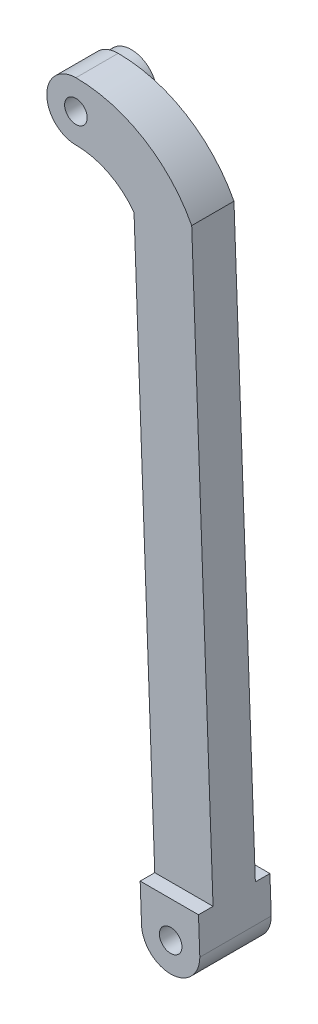
ISO-10303-21;
HEADER;
FILE_DESCRIPTION(('STEP AP214'),'2;1');
FILE_NAME('part.step','',(''),(''),'','','');
FILE_SCHEMA(('AUTOMOTIVE_DESIGN { 1 0 10303 214 1 1 1 1 }'));
ENDSEC;
DATA;
#1=APPLICATION_CONTEXT('core data for automotive mechanical design processes');
#2=APPLICATION_PROTOCOL_DEFINITION('international standard','automotive_design',2000,#1);
#3=PRODUCT_CONTEXT('',#1,'mechanical');
#4=PRODUCT('Part','Part','',(#3));
#5=PRODUCT_RELATED_PRODUCT_CATEGORY('part','',(#4));
#6=PRODUCT_DEFINITION_FORMATION('','',#4);
#7=PRODUCT_DEFINITION_CONTEXT('part definition',#1,'design');
#8=PRODUCT_DEFINITION('design','',#6,#7);
#9=PRODUCT_DEFINITION_SHAPE('','',#8);
#10=(LENGTH_UNIT() NAMED_UNIT(*) SI_UNIT(.MILLI.,.METRE.));
#11=(NAMED_UNIT(*) PLANE_ANGLE_UNIT() SI_UNIT($,.RADIAN.));
#12=(NAMED_UNIT(*) SI_UNIT($,.STERADIAN.) SOLID_ANGLE_UNIT());
#13=UNCERTAINTY_MEASURE_WITH_UNIT(LENGTH_MEASURE(1.E-05),#10,'distance_accuracy_value','');
#14=(GEOMETRIC_REPRESENTATION_CONTEXT(3) GLOBAL_UNCERTAINTY_ASSIGNED_CONTEXT((#13)) GLOBAL_UNIT_ASSIGNED_CONTEXT((#10,
#11,#12)) REPRESENTATION_CONTEXT('',''));
#15=CARTESIAN_POINT('',(0.,0.,0.));
#16=DIRECTION('',(0.,0.,1.));
#17=DIRECTION('',(1.,0.,0.));
#18=AXIS2_PLACEMENT_3D('',#15,#16,#17);
#19=CARTESIAN_POINT('',(-14.9999999999996,76.0802107758638,-2.9));
#20=DIRECTION('',(0.,0.,-1.));
#21=DIRECTION('',(1.,0.,0.));
#22=AXIS2_PLACEMENT_3D('',#19,#20,#21);
#23=PLANE('',#22);
#24=CARTESIAN_POINT('',(-14.9999999999996,76.0802107758638,-2.9));
#25=DIRECTION('',(0.,0.,1.));
#26=DIRECTION('',(1.,0.,0.));
#27=AXIS2_PLACEMENT_3D('',#24,#25,#26);
#28=CIRCLE('',#27,17.9197892241362);
#29=CARTESIAN_POINT('',(0.886406152850287,84.3712267198939,-2.9));
#30=VERTEX_POINT('',#29);
#31=CARTESIAN_POINT('',(-15.,94.,-2.9));
#32=VERTEX_POINT('',#31);
#33=EDGE_CURVE('E120',#30,#32,#28,.T.);
#34=ORIENTED_EDGE('',*,*,#33,.F.);
#35=DIRECTION('',(-0.0368784001181969,0.999319760439431,0.));
#36=VECTOR('',#35,1.);
#37=CARTESIAN_POINT('',(0.886406152850287,84.3712267198939,-2.9));
#38=LINE('',#37,#36);
#39=CARTESIAN_POINT('',(3.81719493079057,4.95359661438663,-2.9));
#40=VERTEX_POINT('',#39);
#41=EDGE_CURVE('E124',#40,#30,#38,.T.);
#42=ORIENTED_EDGE('',*,*,#41,.F.);
#43=DIRECTION('',(1.,0.,0.));
#44=VECTOR('',#43,1.);
#45=CARTESIAN_POINT('',(-4.18280506920944,4.95359661438663,-2.9));
#46=LINE('',#45,#44);
#47=CARTESIAN_POINT('',(-4.18280506920944,4.95359661438663,-2.9));
#48=VERTEX_POINT('',#47);
#49=EDGE_CURVE('E140',#48,#40,#46,.T.);
#50=ORIENTED_EDGE('',*,*,#49,.F.);
#51=DIRECTION('',(0.0368784001181968,-0.999319760439431,0.));
#52=VECTOR('',#51,1.);
#53=CARTESIAN_POINT('',(-7.02534805193541,81.9799687843353,-2.9));
#54=LINE('',#53,#52);
#55=CARTESIAN_POINT('',(-7.02534805193541,81.9799687843353,-2.9));
#56=VERTEX_POINT('',#55);
#57=EDGE_CURVE('E245',#56,#48,#54,.T.);
#58=ORIENTED_EDGE('',*,*,#57,.F.);
#59=CARTESIAN_POINT('',(-15.0000000000001,76.0802107758631,-2.9));
#60=DIRECTION('',(0.,0.,-1.));
#61=DIRECTION('',(1.,0.,0.));
#62=AXIS2_PLACEMENT_3D('',#59,#60,#61);
#63=CIRCLE('',#62,9.9197892241369);
#64=CARTESIAN_POINT('',(-15.,86.,-2.9));
#65=VERTEX_POINT('',#64);
#66=EDGE_CURVE('E242',#65,#56,#63,.T.);
#67=ORIENTED_EDGE('',*,*,#66,.F.);
#68=CARTESIAN_POINT('',(-15.,90.,-2.9));
#69=DIRECTION('',(0.,0.,1.));
#70=DIRECTION('',(1.,0.,0.));
#71=AXIS2_PLACEMENT_3D('',#68,#69,#70);
#72=CIRCLE('',#71,4.);
#73=EDGE_CURVE('E126',#32,#65,#72,.T.);
#74=ORIENTED_EDGE('',*,*,#73,.F.);
#75=EDGE_LOOP('',(#34,#42,#50,#58,#67,#74));
#76=FACE_BOUND('',#75,.T.);
#77=CARTESIAN_POINT('',(-15.,90.,-2.9));
#78=DIRECTION('',(0.,0.,-1.));
#79=DIRECTION('',(-1.,0.,0.));
#80=AXIS2_PLACEMENT_3D('',#77,#78,#79);
#81=CIRCLE('',#80,3.55);
#82=CARTESIAN_POINT('',(-18.55,90.,-2.9));
#83=VERTEX_POINT('',#82);
#84=EDGE_CURVE('E251',#83,#83,#81,.T.);
#85=ORIENTED_EDGE('',*,*,#84,.F.);
#86=EDGE_LOOP('',(#85));
#87=FACE_BOUND('',#86,.T.);
#88=ADVANCED_FACE('F41',(#76,#87),#23,.T.);
#89=CARTESIAN_POINT('',(-15.,76.0802107758632,-4.9));
#90=DIRECTION('',(0.,0.,1.));
#91=DIRECTION('',(1.,0.,0.));
#92=AXIS2_PLACEMENT_3D('',#89,#90,#91);
#93=CYLINDRICAL_SURFACE('',#92,9.91978922413683);
#94=ORIENTED_EDGE('',*,*,#66,.T.);
#95=DIRECTION('',(0.,0.,1.));
#96=VECTOR('',#95,1.);
#97=CARTESIAN_POINT('',(-7.02534805193541,81.9799687843353,-4.9));
#98=LINE('',#97,#96);
#99=CARTESIAN_POINT('',(-7.02534805193541,81.9799687843353,2.9));
#100=VERTEX_POINT('',#99);
#101=EDGE_CURVE('E45',#56,#100,#98,.T.);
#102=ORIENTED_EDGE('',*,*,#101,.T.);
#103=CARTESIAN_POINT('',(-15.0000000000001,76.0802107758631,2.9));
#104=DIRECTION('',(0.,0.,-1.));
#105=DIRECTION('',(1.,0.,0.));
#106=AXIS2_PLACEMENT_3D('',#103,#104,#105);
#107=CIRCLE('',#106,9.9197892241369);
#108=CARTESIAN_POINT('',(-15.,86.,2.9));
#109=VERTEX_POINT('',#108);
#110=EDGE_CURVE('E223',#109,#100,#107,.T.);
#111=ORIENTED_EDGE('',*,*,#110,.F.);
#112=DIRECTION('',(0.,0.,1.));
#113=VECTOR('',#112,1.);
#114=CARTESIAN_POINT('',(-15.,86.,-4.9));
#115=LINE('',#114,#113);
#116=EDGE_CURVE('E11',#65,#109,#115,.T.);
#117=ORIENTED_EDGE('',*,*,#116,.F.);
#118=EDGE_LOOP('',(#94,#102,#111,#117));
#119=FACE_BOUND('',#118,.T.);
#120=ADVANCED_FACE('F43',(#119),#93,.F.);
#121=CARTESIAN_POINT('',(-15.,90.,-4.9));
#122=DIRECTION('',(0.,0.,1.));
#123=DIRECTION('',(1.,0.,0.));
#124=AXIS2_PLACEMENT_3D('',#121,#122,#123);
#125=CYLINDRICAL_SURFACE('',#124,4.00000000000001);
#126=DIRECTION('',(0.,0.,1.));
#127=VECTOR('',#126,1.);
#128=CARTESIAN_POINT('',(-15.,94.,-4.9));
#129=LINE('',#128,#127);
#130=CARTESIAN_POINT('',(-15.,94.,2.9));
#131=VERTEX_POINT('',#130);
#132=EDGE_CURVE('E51',#32,#131,#129,.T.);
#133=ORIENTED_EDGE('',*,*,#132,.F.);
#134=ORIENTED_EDGE('',*,*,#73,.T.);
#135=ORIENTED_EDGE('',*,*,#116,.T.);
#136=CARTESIAN_POINT('',(-15.,90.,2.9));
#137=DIRECTION('',(0.,0.,1.));
#138=DIRECTION('',(1.,0.,0.));
#139=AXIS2_PLACEMENT_3D('',#136,#137,#138);
#140=CIRCLE('',#139,4.);
#141=EDGE_CURVE('E226',#131,#109,#140,.T.);
#142=ORIENTED_EDGE('',*,*,#141,.F.);
#143=EDGE_LOOP('',(#133,#134,#135,#142));
#144=FACE_BOUND('',#143,.T.);
#145=ADVANCED_FACE('F284',(#144),#125,.T.);
#146=CARTESIAN_POINT('',(-15.,76.0802107758632,-4.9));
#147=DIRECTION('',(0.,0.,1.));
#148=DIRECTION('',(1.,0.,0.));
#149=AXIS2_PLACEMENT_3D('',#146,#147,#148);
#150=CYLINDRICAL_SURFACE('',#149,17.9197892241368);
#151=ORIENTED_EDGE('',*,*,#33,.T.);
#152=ORIENTED_EDGE('',*,*,#132,.T.);
#153=CARTESIAN_POINT('',(-14.9999999999996,76.0802107758638,2.9));
#154=DIRECTION('',(0.,0.,1.));
#155=DIRECTION('',(1.,0.,0.));
#156=AXIS2_PLACEMENT_3D('',#153,#154,#155);
#157=CIRCLE('',#156,17.9197892241362);
#158=CARTESIAN_POINT('',(0.886406152850287,84.3712267198939,2.9));
#159=VERTEX_POINT('',#158);
#160=EDGE_CURVE('E145',#159,#131,#157,.T.);
#161=ORIENTED_EDGE('',*,*,#160,.F.);
#162=DIRECTION('',(0.,0.,1.));
#163=VECTOR('',#162,1.);
#164=CARTESIAN_POINT('',(0.886406152850288,84.3712267198939,-4.9));
#165=LINE('',#164,#163);
#166=EDGE_CURVE('E137',#30,#159,#165,.T.);
#167=ORIENTED_EDGE('',*,*,#166,.F.);
#168=EDGE_LOOP('',(#151,#152,#161,#167));
#169=FACE_BOUND('',#168,.T.);
#170=ADVANCED_FACE('F143',(#169),#150,.T.);
#171=CARTESIAN_POINT('',(-15.,90.,-4.9));
#172=DIRECTION('',(0.,0.,1.));
#173=DIRECTION('',(1.,0.,0.));
#174=AXIS2_PLACEMENT_3D('',#171,#172,#173);
#175=CYLINDRICAL_SURFACE('',#174,1.54999999999999);
#176=CARTESIAN_POINT('',(-15.,90.,2.9));
#177=DIRECTION('',(0.,0.,1.));
#178=DIRECTION('',(1.,0.,0.));
#179=AXIS2_PLACEMENT_3D('',#176,#177,#178);
#180=CIRCLE('',#179,1.54999999999999);
#181=CARTESIAN_POINT('',(-13.45,90.,2.9));
#182=VERTEX_POINT('',#181);
#183=EDGE_CURVE('E198',#182,#182,#180,.F.);
#184=ORIENTED_EDGE('',*,*,#183,.F.);
#185=EDGE_LOOP('',(#184));
#186=FACE_BOUND('',#185,.T.);
#187=CARTESIAN_POINT('',(-15.,90.,-4.7));
#188=DIRECTION('',(0.,0.,-1.));
#189=DIRECTION('',(-1.,0.,0.));
#190=AXIS2_PLACEMENT_3D('',#187,#188,#189);
#191=CIRCLE('',#190,1.55);
#192=CARTESIAN_POINT('',(-16.55,90.,-4.7));
#193=VERTEX_POINT('',#192);
#194=EDGE_CURVE('E255',#193,#193,#191,.T.);
#195=ORIENTED_EDGE('',*,*,#194,.T.);
#196=EDGE_LOOP('',(#195));
#197=FACE_BOUND('',#196,.T.);
#198=ADVANCED_FACE('F263',(#186,#197),#175,.F.);
#199=CARTESIAN_POINT('',(3.99455993441889,0.147413255886023,-4.9));
#200=DIRECTION('',(0.999319760439431,0.0368784001181967,0.));
#201=DIRECTION('',(-0.0368784001181967,0.999319760439431,0.));
#202=AXIS2_PLACEMENT_3D('',#199,#200,#201);
#203=PLANE('',#202);
#204=DIRECTION('',(-0.0368784001181967,0.999319760439431,0.));
#205=VECTOR('',#204,1.);
#206=CARTESIAN_POINT('',(3.99455993441889,0.147413255886023,-4.9));
#207=LINE('',#206,#205);
#208=CARTESIAN_POINT('',(4.,0.,-4.9));
#209=VERTEX_POINT('',#208);
#210=CARTESIAN_POINT('',(3.81719493079056,4.95359661438663,-4.9));
#211=VERTEX_POINT('',#210);
#212=EDGE_CURVE('E168',#209,#211,#207,.T.);
#213=ORIENTED_EDGE('',*,*,#212,.T.);
#214=DIRECTION('',(0.,0.,-1.));
#215=VECTOR('',#214,1.);
#216=CARTESIAN_POINT('',(3.81719493079057,4.95359661438663,-2.9));
#217=LINE('',#216,#215);
#218=EDGE_CURVE('E59',#40,#211,#217,.T.);
#219=ORIENTED_EDGE('',*,*,#218,.F.);
#220=ORIENTED_EDGE('',*,*,#41,.T.);
#221=ORIENTED_EDGE('',*,*,#166,.T.);
#222=DIRECTION('',(-0.0368784001181969,0.999319760439431,0.));
#223=VECTOR('',#222,1.);
#224=CARTESIAN_POINT('',(0.886406152850287,84.3712267198939,2.9));
#225=LINE('',#224,#223);
#226=CARTESIAN_POINT('',(3.81719493079057,4.95359661438663,2.9));
#227=VERTEX_POINT('',#226);
#228=EDGE_CURVE('E205',#227,#159,#225,.T.);
#229=ORIENTED_EDGE('',*,*,#228,.F.);
#230=DIRECTION('',(0.,0.,1.));
#231=VECTOR('',#230,1.);
#232=CARTESIAN_POINT('',(3.81719493079057,4.95359661438663,2.9));
#233=LINE('',#232,#231);
#234=CARTESIAN_POINT('',(3.81719493079057,4.95359661438663,4.9));
#235=VERTEX_POINT('',#234);
#236=EDGE_CURVE('E202',#227,#235,#233,.T.);
#237=ORIENTED_EDGE('',*,*,#236,.T.);
#238=DIRECTION('',(-0.0368784001181967,0.999319760439431,0.));
#239=VECTOR('',#238,1.);
#240=CARTESIAN_POINT('',(3.99455993441889,0.147413255886023,4.9));
#241=LINE('',#240,#239);
#242=CARTESIAN_POINT('',(4.,0.,4.9));
#243=VERTEX_POINT('',#242);
#244=EDGE_CURVE('E187',#243,#235,#241,.T.);
#245=ORIENTED_EDGE('',*,*,#244,.F.);
#246=DIRECTION('',(0.,0.,1.));
#247=VECTOR('',#246,1.);
#248=CARTESIAN_POINT('',(4.,0.,-4.9));
#249=LINE('',#248,#247);
#250=EDGE_CURVE('E147',#209,#243,#249,.T.);
#251=ORIENTED_EDGE('',*,*,#250,.F.);
#252=EDGE_LOOP('',(#213,#219,#220,#221,#229,#237,#245,#251));
#253=FACE_BOUND('',#252,.T.);
#254=ADVANCED_FACE('F135',(#253),#203,.T.);
#255=CARTESIAN_POINT('',(-3.99455993441889,-0.147413255886023,-4.9));
#256=DIRECTION('',(0.999319760439431,0.0368784001181967,0.));
#257=DIRECTION('',(-0.0368784001181967,0.999319760439431,0.));
#258=AXIS2_PLACEMENT_3D('',#255,#256,#257);
#259=PLANE('',#258);
#260=DIRECTION('',(0.,0.,-1.));
#261=VECTOR('',#260,1.);
#262=CARTESIAN_POINT('',(-4.18280506920944,4.95359661438663,-2.9));
#263=LINE('',#262,#261);
#264=CARTESIAN_POINT('',(-4.18280506920944,4.95359661438663,-4.9));
#265=VERTEX_POINT('',#264);
#266=EDGE_CURVE('E212',#48,#265,#263,.T.);
#267=ORIENTED_EDGE('',*,*,#266,.T.);
#268=DIRECTION('',(-0.0368784001181967,0.999319760439431,0.));
#269=VECTOR('',#268,1.);
#270=CARTESIAN_POINT('',(-3.99455993441889,-0.147413255886023,-4.9));
#271=LINE('',#270,#269);
#272=CARTESIAN_POINT('',(-4.,0.,-4.9));
#273=VERTEX_POINT('',#272);
#274=EDGE_CURVE('E179',#273,#265,#271,.T.);
#275=ORIENTED_EDGE('',*,*,#274,.F.);
#276=DIRECTION('',(0.,0.,1.));
#277=VECTOR('',#276,1.);
#278=CARTESIAN_POINT('',(-4.,0.,-4.9));
#279=LINE('',#278,#277);
#280=CARTESIAN_POINT('',(-4.,0.,4.9));
#281=VERTEX_POINT('',#280);
#282=EDGE_CURVE('E152',#273,#281,#279,.T.);
#283=ORIENTED_EDGE('',*,*,#282,.T.);
#284=DIRECTION('',(-0.0368784001181967,0.999319760439431,0.));
#285=VECTOR('',#284,1.);
#286=CARTESIAN_POINT('',(-3.99455993441889,-0.147413255886023,4.9));
#287=LINE('',#286,#285);
#288=CARTESIAN_POINT('',(-4.18280506920944,4.95359661438663,4.9));
#289=VERTEX_POINT('',#288);
#290=EDGE_CURVE('E195',#281,#289,#287,.T.);
#291=ORIENTED_EDGE('',*,*,#290,.T.);
#292=DIRECTION('',(0.,0.,1.));
#293=VECTOR('',#292,1.);
#294=CARTESIAN_POINT('',(-4.18280506920944,4.95359661438663,2.9));
#295=LINE('',#294,#293);
#296=CARTESIAN_POINT('',(-4.18280506920944,4.95359661438663,2.9));
#297=VERTEX_POINT('',#296);
#298=EDGE_CURVE('E67',#297,#289,#295,.T.);
#299=ORIENTED_EDGE('',*,*,#298,.F.);
#300=DIRECTION('',(0.0368784001181968,-0.999319760439431,0.));
#301=VECTOR('',#300,1.);
#302=CARTESIAN_POINT('',(-7.02534805193541,81.9799687843353,2.9));
#303=LINE('',#302,#301);
#304=EDGE_CURVE('E219',#100,#297,#303,.T.);
#305=ORIENTED_EDGE('',*,*,#304,.F.);
#306=ORIENTED_EDGE('',*,*,#101,.F.);
#307=ORIENTED_EDGE('',*,*,#57,.T.);
#308=EDGE_LOOP('',(#267,#275,#283,#291,#299,#305,#306,#307));
#309=FACE_BOUND('',#308,.T.);
#310=ADVANCED_FACE('F301',(#309),#259,.F.);
#311=CARTESIAN_POINT('',(0.,0.,-4.9));
#312=DIRECTION('',(0.,0.,1.));
#313=DIRECTION('',(1.,0.,0.));
#314=AXIS2_PLACEMENT_3D('',#311,#312,#313);
#315=PLANE('',#314);
#316=CARTESIAN_POINT('',(0.,0.,-4.9));
#317=DIRECTION('',(0.,0.,1.));
#318=DIRECTION('',(1.,0.,0.));
#319=AXIS2_PLACEMENT_3D('',#316,#317,#318);
#320=CIRCLE('',#319,1.55);
#321=CARTESIAN_POINT('',(1.55,0.,-4.9));
#322=VERTEX_POINT('',#321);
#323=EDGE_CURVE('E160',#322,#322,#320,.T.);
#324=ORIENTED_EDGE('',*,*,#323,.T.);
#325=EDGE_LOOP('',(#324));
#326=FACE_BOUND('',#325,.T.);
#327=DIRECTION('',(1.,0.,0.));
#328=VECTOR('',#327,1.);
#329=CARTESIAN_POINT('',(-4.18280506920944,4.95359661438663,-4.9));
#330=LINE('',#329,#328);
#331=EDGE_CURVE('E131',#265,#211,#330,.T.);
#332=ORIENTED_EDGE('',*,*,#331,.T.);
#333=ORIENTED_EDGE('',*,*,#212,.F.);
#334=CARTESIAN_POINT('',(0.,0.,-4.9));
#335=DIRECTION('',(0.,0.,1.));
#336=DIRECTION('',(1.,0.,0.));
#337=AXIS2_PLACEMENT_3D('',#334,#335,#336);
#338=CIRCLE('',#337,4.);
#339=EDGE_CURVE('E173',#273,#209,#338,.T.);
#340=ORIENTED_EDGE('',*,*,#339,.F.);
#341=ORIENTED_EDGE('',*,*,#274,.T.);
#342=EDGE_LOOP('',(#332,#333,#340,#341));
#343=FACE_BOUND('',#342,.T.);
#344=ADVANCED_FACE('F297',(#326,#343),#315,.F.);
#345=CARTESIAN_POINT('',(0.,0.,-4.9));
#346=DIRECTION('',(0.,0.,1.));
#347=DIRECTION('',(1.,0.,0.));
#348=AXIS2_PLACEMENT_3D('',#345,#346,#347);
#349=CYLINDRICAL_SURFACE('',#348,4.);
#350=ORIENTED_EDGE('',*,*,#250,.T.);
#351=CARTESIAN_POINT('',(0.,0.,4.9));
#352=DIRECTION('',(0.,0.,1.));
#353=DIRECTION('',(1.,0.,0.));
#354=AXIS2_PLACEMENT_3D('',#351,#352,#353);
#355=CIRCLE('',#354,4.);
#356=EDGE_CURVE('E191',#281,#243,#355,.T.);
#357=ORIENTED_EDGE('',*,*,#356,.F.);
#358=ORIENTED_EDGE('',*,*,#282,.F.);
#359=ORIENTED_EDGE('',*,*,#339,.T.);
#360=EDGE_LOOP('',(#350,#357,#358,#359));
#361=FACE_BOUND('',#360,.T.);
#362=ADVANCED_FACE('F300',(#361),#349,.T.);
#363=CARTESIAN_POINT('',(0.,0.,-4.9));
#364=DIRECTION('',(0.,0.,1.));
#365=DIRECTION('',(1.,0.,0.));
#366=AXIS2_PLACEMENT_3D('',#363,#364,#365);
#367=CYLINDRICAL_SURFACE('',#366,1.55);
#368=ORIENTED_EDGE('',*,*,#323,.F.);
#369=EDGE_LOOP('',(#368));
#370=FACE_BOUND('',#369,.T.);
#371=CARTESIAN_POINT('',(0.,0.,4.9));
#372=DIRECTION('',(0.,0.,1.));
#373=DIRECTION('',(1.,0.,0.));
#374=AXIS2_PLACEMENT_3D('',#371,#372,#373);
#375=CIRCLE('',#374,1.55);
#376=CARTESIAN_POINT('',(1.55,0.,4.9));
#377=VERTEX_POINT('',#376);
#378=EDGE_CURVE('E183',#377,#377,#375,.T.);
#379=ORIENTED_EDGE('',*,*,#378,.T.);
#380=EDGE_LOOP('',(#379));
#381=FACE_BOUND('',#380,.T.);
#382=ADVANCED_FACE('F295',(#370,#381),#367,.F.);
#383=CARTESIAN_POINT('',(0.,0.,4.9));
#384=DIRECTION('',(0.,0.,1.));
#385=DIRECTION('',(1.,0.,0.));
#386=AXIS2_PLACEMENT_3D('',#383,#384,#385);
#387=PLANE('',#386);
#388=DIRECTION('',(1.,0.,0.));
#389=VECTOR('',#388,1.);
#390=CARTESIAN_POINT('',(-4.18280506920944,4.95359661438663,4.9));
#391=LINE('',#390,#389);
#392=EDGE_CURVE('E209',#289,#235,#391,.T.);
#393=ORIENTED_EDGE('',*,*,#392,.F.);
#394=ORIENTED_EDGE('',*,*,#290,.F.);
#395=ORIENTED_EDGE('',*,*,#356,.T.);
#396=ORIENTED_EDGE('',*,*,#244,.T.);
#397=EDGE_LOOP('',(#393,#394,#395,#396));
#398=FACE_BOUND('',#397,.T.);
#399=ORIENTED_EDGE('',*,*,#378,.F.);
#400=EDGE_LOOP('',(#399));
#401=FACE_BOUND('',#400,.T.);
#402=ADVANCED_FACE('F289',(#398,#401),#387,.T.);
#403=CARTESIAN_POINT('',(-14.9999999999996,76.0802107758638,2.9));
#404=DIRECTION('',(0.,0.,1.));
#405=DIRECTION('',(1.,0.,0.));
#406=AXIS2_PLACEMENT_3D('',#403,#404,#405);
#407=PLANE('',#406);
#408=ORIENTED_EDGE('',*,*,#160,.T.);
#409=ORIENTED_EDGE('',*,*,#141,.T.);
#410=ORIENTED_EDGE('',*,*,#110,.T.);
#411=ORIENTED_EDGE('',*,*,#304,.T.);
#412=DIRECTION('',(1.,0.,0.));
#413=VECTOR('',#412,1.);
#414=CARTESIAN_POINT('',(-4.18280506920944,4.95359661438663,2.9));
#415=LINE('',#414,#413);
#416=EDGE_CURVE('E215',#297,#227,#415,.T.);
#417=ORIENTED_EDGE('',*,*,#416,.T.);
#418=ORIENTED_EDGE('',*,*,#228,.T.);
#419=EDGE_LOOP('',(#408,#409,#410,#411,#417,#418));
#420=FACE_BOUND('',#419,.T.);
#421=ORIENTED_EDGE('',*,*,#183,.T.);
#422=EDGE_LOOP('',(#421));
#423=FACE_BOUND('',#422,.T.);
#424=ADVANCED_FACE('F286',(#420,#423),#407,.T.);
#425=CARTESIAN_POINT('',(-4.18280506920944,4.95359661438663,2.9));
#426=DIRECTION('',(0.,-1.,0.));
#427=DIRECTION('',(1.,0.,0.));
#428=AXIS2_PLACEMENT_3D('',#425,#426,#427);
#429=PLANE('',#428);
#430=ORIENTED_EDGE('',*,*,#392,.T.);
#431=ORIENTED_EDGE('',*,*,#236,.F.);
#432=ORIENTED_EDGE('',*,*,#416,.F.);
#433=ORIENTED_EDGE('',*,*,#298,.T.);
#434=EDGE_LOOP('',(#430,#431,#432,#433));
#435=FACE_BOUND('',#434,.T.);
#436=ADVANCED_FACE('F277',(#435),#429,.F.);
#437=CARTESIAN_POINT('',(-4.18280506920944,4.95359661438663,-2.9));
#438=DIRECTION('',(0.,1.,0.));
#439=DIRECTION('',(-1.,0.,0.));
#440=AXIS2_PLACEMENT_3D('',#437,#438,#439);
#441=PLANE('',#440);
#442=ORIENTED_EDGE('',*,*,#331,.F.);
#443=ORIENTED_EDGE('',*,*,#266,.F.);
#444=ORIENTED_EDGE('',*,*,#49,.T.);
#445=ORIENTED_EDGE('',*,*,#218,.T.);
#446=EDGE_LOOP('',(#442,#443,#444,#445));
#447=FACE_BOUND('',#446,.T.);
#448=ADVANCED_FACE('F268',(#447),#441,.T.);
#449=CARTESIAN_POINT('',(-15.,90.,-4.7));
#450=DIRECTION('',(0.,0.,-1.));
#451=DIRECTION('',(-1.,0.,0.));
#452=AXIS2_PLACEMENT_3D('',#449,#450,#451);
#453=PLANE('',#452);
#454=CARTESIAN_POINT('',(-15.,90.,-4.7));
#455=DIRECTION('',(0.,0.,-1.));
#456=DIRECTION('',(-1.,0.,0.));
#457=AXIS2_PLACEMENT_3D('',#454,#455,#456);
#458=CIRCLE('',#457,3.55);
#459=CARTESIAN_POINT('',(-18.55,90.,-4.7));
#460=VERTEX_POINT('',#459);
#461=EDGE_CURVE('E239',#460,#460,#458,.T.);
#462=ORIENTED_EDGE('',*,*,#461,.T.);
#463=EDGE_LOOP('',(#462));
#464=FACE_BOUND('',#463,.T.);
#465=ORIENTED_EDGE('',*,*,#194,.F.);
#466=EDGE_LOOP('',(#465));
#467=FACE_BOUND('',#466,.T.);
#468=ADVANCED_FACE('F265',(#464,#467),#453,.T.);
#469=CARTESIAN_POINT('',(-15.,90.,-4.7));
#470=DIRECTION('',(0.,0.,1.));
#471=DIRECTION('',(1.,0.,0.));
#472=AXIS2_PLACEMENT_3D('',#469,#470,#471);
#473=CYLINDRICAL_SURFACE('',#472,3.55);
#474=ORIENTED_EDGE('',*,*,#461,.F.);
#475=EDGE_LOOP('',(#474));
#476=FACE_BOUND('',#475,.T.);
#477=ORIENTED_EDGE('',*,*,#84,.T.);
#478=EDGE_LOOP('',(#477));
#479=FACE_BOUND('',#478,.T.);
#480=ADVANCED_FACE('F267',(#476,#479),#473,.T.);
#481=CLOSED_SHELL('',(#88,#120,#145,#170,#198,#254,#310,#344,#362,#382,#402,#424,#436,#448,#468,#480));
#482=MANIFOLD_SOLID_BREP('B2',#481);
#483=ADVANCED_BREP_SHAPE_REPRESENTATION('',(#18,#482),#14);
#484=SHAPE_DEFINITION_REPRESENTATION(#9,#483);
ENDSEC;
END-ISO-10303-21;
